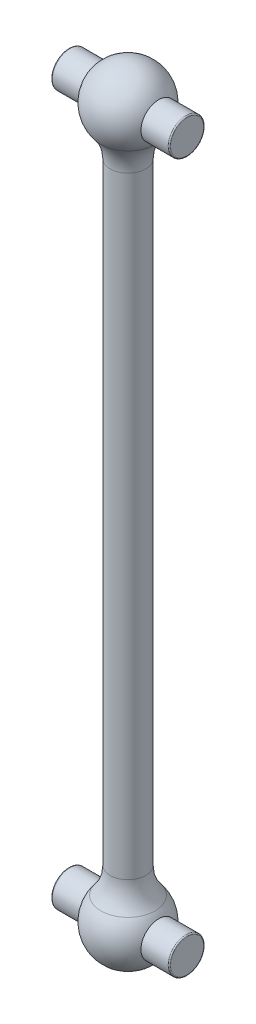
ISO-10303-21;
HEADER;
FILE_DESCRIPTION(('STEP AP214'),'2;1');
FILE_NAME('part.step','',(''),(''),'','','');
FILE_SCHEMA(('AUTOMOTIVE_DESIGN { 1 0 10303 214 1 1 1 1 }'));
ENDSEC;
DATA;
#1=APPLICATION_CONTEXT('core data for automotive mechanical design processes');
#2=APPLICATION_PROTOCOL_DEFINITION('international standard','automotive_design',2000,#1);
#3=PRODUCT_CONTEXT('',#1,'mechanical');
#4=PRODUCT('Part','Part','',(#3));
#5=PRODUCT_RELATED_PRODUCT_CATEGORY('part','',(#4));
#6=PRODUCT_DEFINITION_FORMATION('','',#4);
#7=PRODUCT_DEFINITION_CONTEXT('part definition',#1,'design');
#8=PRODUCT_DEFINITION('design','',#6,#7);
#9=PRODUCT_DEFINITION_SHAPE('','',#8);
#10=(LENGTH_UNIT() NAMED_UNIT(*) SI_UNIT(.MILLI.,.METRE.));
#11=(NAMED_UNIT(*) PLANE_ANGLE_UNIT() SI_UNIT($,.RADIAN.));
#12=(NAMED_UNIT(*) SI_UNIT($,.STERADIAN.) SOLID_ANGLE_UNIT());
#13=UNCERTAINTY_MEASURE_WITH_UNIT(LENGTH_MEASURE(1.E-05),#10,'distance_accuracy_value','');
#14=(GEOMETRIC_REPRESENTATION_CONTEXT(3) GLOBAL_UNCERTAINTY_ASSIGNED_CONTEXT((#13)) GLOBAL_UNIT_ASSIGNED_CONTEXT((#10,
#11,#12)) REPRESENTATION_CONTEXT('',''));
#15=CARTESIAN_POINT('',(0.,0.,0.));
#16=DIRECTION('',(0.,0.,1.));
#17=DIRECTION('',(1.,0.,0.));
#18=AXIS2_PLACEMENT_3D('',#15,#16,#17);
#19=CARTESIAN_POINT('',(0.,38.1,0.));
#20=DIRECTION('',(0.,-1.,0.));
#21=DIRECTION('',(0.,0.,-1.));
#22=AXIS2_PLACEMENT_3D('',#19,#20,#21);
#23=CYLINDRICAL_SURFACE('',#22,1.905);
#24=CARTESIAN_POINT('',(0.,32.8660555159389,0.));
#25=DIRECTION('',(0.,1.,0.));
#26=DIRECTION('',(-1.,0.,0.));
#27=AXIS2_PLACEMENT_3D('',#24,#25,#26);
#28=CIRCLE('',#27,1.905);
#29=CARTESIAN_POINT('',(0.,32.8660555159389,-1.905));
#30=VERTEX_POINT('',#29);
#31=EDGE_CURVE('E81',#30,#30,#28,.T.);
#32=CARTESIAN_POINT('',(0.,-32.8660555159389,0.));
#33=DIRECTION('',(0.,-1.,0.));
#34=DIRECTION('',(1.,0.,0.));
#35=AXIS2_PLACEMENT_3D('',#32,#33,#34);
#36=CIRCLE('',#35,1.905);
#37=CARTESIAN_POINT('',(0.,-32.8660555159389,-1.905));
#38=VERTEX_POINT('',#37);
#39=EDGE_CURVE('E53',#38,#38,#36,.T.);
#40=CARTESIAN_POINT('',(0.,32.8660555159389,-1.905));
#41=CARTESIAN_POINT('',(0.,32.1813460260235,-1.905));
#42=CARTESIAN_POINT('',(0.,31.4966365361081,-1.905));
#43=CARTESIAN_POINT('',(0.,30.1272175562773,-1.905));
#44=CARTESIAN_POINT('',(0.,29.442508066362,-1.905));
#45=CARTESIAN_POINT('',(0.,28.0730890865312,-1.905));
#46=CARTESIAN_POINT('',(0.,27.3883795966158,-1.905));
#47=CARTESIAN_POINT('',(0.,26.018960616785,-1.905));
#48=CARTESIAN_POINT('',(0.,25.3342511268696,-1.905));
#49=CARTESIAN_POINT('',(0.,23.9648321470388,-1.905));
#50=CARTESIAN_POINT('',(0.,23.2801226571234,-1.905));
#51=CARTESIAN_POINT('',(0.,21.9107036772926,-1.905));
#52=CARTESIAN_POINT('',(0.,21.2259941873772,-1.905));
#53=CARTESIAN_POINT('',(0.,19.8565752075464,-1.905));
#54=CARTESIAN_POINT('',(0.,19.171865717631,-1.905));
#55=CARTESIAN_POINT('',(0.,17.8024467378003,-1.905));
#56=CARTESIAN_POINT('',(0.,17.1177372478849,-1.905));
#57=CARTESIAN_POINT('',(0.,15.7483182680541,-1.905));
#58=CARTESIAN_POINT('',(0.,15.0636087781387,-1.905));
#59=CARTESIAN_POINT('',(0.,13.6941897983079,-1.905));
#60=CARTESIAN_POINT('',(0.,13.0094803083925,-1.905));
#61=CARTESIAN_POINT('',(0.,11.6400613285617,-1.905));
#62=CARTESIAN_POINT('',(0.,10.9553518386463,-1.905));
#63=CARTESIAN_POINT('',(0.,9.58593285881552,-1.905));
#64=CARTESIAN_POINT('',(0.,8.90122336890013,-1.905));
#65=CARTESIAN_POINT('',(0.,7.53180438906934,-1.905));
#66=CARTESIAN_POINT('',(0.,6.84709489915395,-1.905));
#67=CARTESIAN_POINT('',(0.,5.47767591932316,-1.905));
#68=CARTESIAN_POINT('',(0.,4.79296642940776,-1.905));
#69=CARTESIAN_POINT('',(0.,3.42354744957698,-1.905));
#70=CARTESIAN_POINT('',(0.,2.73883795966158,-1.905));
#71=CARTESIAN_POINT('',(0.,1.36941897983079,-1.905));
#72=CARTESIAN_POINT('',(0.,0.684709489915396,-1.905));
#73=CARTESIAN_POINT('',(0.,-0.684709489915392,-1.905));
#74=CARTESIAN_POINT('',(0.,-1.36941897983078,-1.905));
#75=CARTESIAN_POINT('',(0.,-2.73883795966157,-1.905));
#76=CARTESIAN_POINT('',(0.,-3.42354744957697,-1.905));
#77=CARTESIAN_POINT('',(0.,-4.79296642940776,-1.905));
#78=CARTESIAN_POINT('',(0.,-5.47767591932316,-1.905));
#79=CARTESIAN_POINT('',(0.,-6.84709489915394,-1.905));
#80=CARTESIAN_POINT('',(0.,-7.53180438906934,-1.905));
#81=CARTESIAN_POINT('',(0.,-8.90122336890012,-1.905));
#82=CARTESIAN_POINT('',(0.,-9.58593285881552,-1.905));
#83=CARTESIAN_POINT('',(0.,-10.9553518386463,-1.905));
#84=CARTESIAN_POINT('',(0.,-11.6400613285617,-1.905));
#85=CARTESIAN_POINT('',(0.,-13.0094803083925,-1.905));
#86=CARTESIAN_POINT('',(0.,-13.6941897983079,-1.905));
#87=CARTESIAN_POINT('',(0.,-15.0636087781387,-1.905));
#88=CARTESIAN_POINT('',(0.,-15.7483182680541,-1.905));
#89=CARTESIAN_POINT('',(0.,-17.1177372478849,-1.905));
#90=CARTESIAN_POINT('',(0.,-17.8024467378002,-1.905));
#91=CARTESIAN_POINT('',(0.,-19.171865717631,-1.905));
#92=CARTESIAN_POINT('',(0.,-19.8565752075464,-1.905));
#93=CARTESIAN_POINT('',(0.,-21.2259941873772,-1.905));
#94=CARTESIAN_POINT('',(0.,-21.9107036772926,-1.905));
#95=CARTESIAN_POINT('',(0.,-23.2801226571234,-1.905));
#96=CARTESIAN_POINT('',(0.,-23.9648321470388,-1.905));
#97=CARTESIAN_POINT('',(0.,-25.3342511268696,-1.905));
#98=CARTESIAN_POINT('',(0.,-26.018960616785,-1.905));
#99=CARTESIAN_POINT('',(0.,-27.3883795966158,-1.905));
#100=CARTESIAN_POINT('',(0.,-28.0730890865312,-1.905));
#101=CARTESIAN_POINT('',(0.,-29.4425080663619,-1.905));
#102=CARTESIAN_POINT('',(0.,-30.1272175562773,-1.905));
#103=CARTESIAN_POINT('',(0.,-31.4966365361081,-1.905));
#104=CARTESIAN_POINT('',(0.,-32.1813460260235,-1.905));
#105=CARTESIAN_POINT('',(0.,-32.8660555159389,-1.905));
#106=B_SPLINE_CURVE_WITH_KNOTS('',3,(#40,#41,#42,#43,#44,#45,#46,#47,#48,#49,#50,#51,#52,#53,
#54,#55,#56,#57,#58,#59,#60,#61,#62,#63,#64,#65,#66,#67,#68,#69,#70,#71,#72,#73,#74,#75,#76,#77,
#78,#79,#80,#81,#82,#83,#84,#85,#86,#87,#88,#89,#90,#91,#92,#93,#94,#95,#96,#97,#98,#99,#100,
#101,#102,#103,#104,#105),.UNSPECIFIED.,.F.,.F.,(4,2,2,2,2,2,2,2,2,2,2,2,2,2,2,2,2,2,2,2,2,2,2,
2,2,2,2,2,2,2,2,2,4),(0.,2.05412846974619,4.10825693949237,6.16238540923855,8.21651387898473,
10.2706423487309,12.3247708184771,14.3788992882233,16.4330277579695,18.4871562277156,
20.5412846974618,22.595413167208,24.6495416369542,26.7036701067004,28.7577985764466,
30.8119270461927,32.8660555159389,34.9201839856851,36.9743124554313,39.0284409251775,
41.0825693949237,43.1366978646698,45.190826334416,47.2449548041622,49.2990832739084,
51.3532117436546,53.4073402134008,55.4614686831469,57.5155971528931,59.5697256226393,
61.6238540923855,63.6779825621317,65.7321110318778),.UNSPECIFIED.);
#107=EDGE_CURVE('BSEAM33',#30,#38,#106,.T.);
#108=ORIENTED_EDGE('',*,*,#31,.F.);
#109=ORIENTED_EDGE('',*,*,#39,.F.);
#110=ORIENTED_EDGE('',*,*,#107,.T.);
#111=ORIENTED_EDGE('',*,*,#107,.F.);
#112=EDGE_LOOP('',(#108,#110,#109,#111));
#113=FACE_BOUND('',#112,.T.);
#114=ADVANCED_FACE('F33',(#113),#23,.T.);
#115=CARTESIAN_POINT('',(0.,38.1,0.));
#116=DIRECTION('',(0.,1.,0.));
#117=DIRECTION('',(1.,0.,0.));
#118=AXIS2_PLACEMENT_3D('',#115,#116,#117);
#119=SPHERICAL_SURFACE('',#118,3.81);
#120=CARTESIAN_POINT('',(0.,35.6509792070943,0.));
#121=DIRECTION('',(0.,1.,0.));
#122=DIRECTION('',(-1.,0.,0.));
#123=AXIS2_PLACEMENT_3D('',#120,#121,#122);
#124=CIRCLE('',#123,2.91862932828332);
#125=CARTESIAN_POINT('',(-2.91862932828331,35.6509792070943,0.));
#126=VERTEX_POINT('',#125);
#127=EDGE_CURVE('E84',#126,#126,#124,.T.);
#128=ORIENTED_EDGE('',*,*,#127,.T.);
#129=EDGE_LOOP('',(#128));
#130=FACE_BOUND('',#129,.T.);
#131=CARTESIAN_POINT('',(3.29955678841871,38.1,0.));
#132=DIRECTION('',(-1.,0.,0.));
#133=DIRECTION('',(0.,0.,1.));
#134=AXIS2_PLACEMENT_3D('',#131,#132,#133);
#135=CIRCLE('',#134,1.905);
#136=CARTESIAN_POINT('',(3.29955678841871,38.1,1.905));
#137=VERTEX_POINT('',#136);
#138=EDGE_CURVE('E78',#137,#137,#135,.F.);
#139=ORIENTED_EDGE('',*,*,#138,.F.);
#140=EDGE_LOOP('',(#139));
#141=FACE_BOUND('',#140,.T.);
#142=CARTESIAN_POINT('',(-3.29955678841871,38.1,0.));
#143=DIRECTION('',(1.,0.,0.));
#144=DIRECTION('',(0.,0.,-1.));
#145=AXIS2_PLACEMENT_3D('',#142,#143,#144);
#146=CIRCLE('',#145,1.905);
#147=CARTESIAN_POINT('',(-3.29955678841871,38.1,-1.905));
#148=VERTEX_POINT('',#147);
#149=EDGE_CURVE('E75',#148,#148,#146,.F.);
#150=ORIENTED_EDGE('',*,*,#149,.F.);
#151=EDGE_LOOP('',(#150));
#152=FACE_BOUND('',#151,.T.);
#153=ADVANCED_FACE('F110',(#130,#141,#152),#119,.T.);
#154=CARTESIAN_POINT('',(0.,32.8660555159389,0.));
#155=DIRECTION('',(0.,1.,0.));
#156=DIRECTION('',(-1.,0.,0.));
#157=AXIS2_PLACEMENT_3D('',#154,#155,#156);
#158=TOROIDAL_SURFACE('',#157,6.23757214231844,4.33257214231844);
#159=ORIENTED_EDGE('',*,*,#127,.F.);
#160=EDGE_LOOP('',(#159));
#161=FACE_BOUND('',#160,.T.);
#162=ORIENTED_EDGE('',*,*,#31,.T.);
#163=EDGE_LOOP('',(#162));
#164=FACE_BOUND('',#163,.T.);
#165=ADVANCED_FACE('F116',(#161,#164),#158,.F.);
#166=CARTESIAN_POINT('',(6.35,38.1,0.));
#167=DIRECTION('',(1.,0.,0.));
#168=DIRECTION('',(0.,0.,-1.));
#169=AXIS2_PLACEMENT_3D('',#166,#167,#168);
#170=PLANE('',#169);
#171=CARTESIAN_POINT('',(6.35,38.1,0.));
#172=DIRECTION('',(1.,0.,0.));
#173=DIRECTION('',(0.,0.,-1.));
#174=AXIS2_PLACEMENT_3D('',#171,#172,#173);
#175=CIRCLE('',#174,1.778);
#176=CARTESIAN_POINT('',(6.35,38.1,-1.778));
#177=VERTEX_POINT('',#176);
#178=EDGE_CURVE('E66',#177,#177,#175,.T.);
#179=ORIENTED_EDGE('',*,*,#178,.T.);
#180=EDGE_LOOP('',(#179));
#181=FACE_BOUND('',#180,.T.);
#182=ADVANCED_FACE('F240',(#181),#170,.T.);
#183=CARTESIAN_POINT('',(6.35,38.1,0.));
#184=DIRECTION('',(-1.,0.,0.));
#185=DIRECTION('',(0.,0.,1.));
#186=AXIS2_PLACEMENT_3D('',#183,#184,#185);
#187=CYLINDRICAL_SURFACE('',#186,1.905);
#188=CARTESIAN_POINT('',(6.223,38.1,0.));
#189=DIRECTION('',(1.,0.,0.));
#190=DIRECTION('',(0.,0.,-1.));
#191=AXIS2_PLACEMENT_3D('',#188,#189,#190);
#192=CIRCLE('',#191,1.905);
#193=CARTESIAN_POINT('',(6.223,38.1,-1.905));
#194=VERTEX_POINT('',#193);
#195=EDGE_CURVE('E63',#194,#194,#192,.F.);
#196=ORIENTED_EDGE('',*,*,#195,.T.);
#197=EDGE_LOOP('',(#196));
#198=FACE_BOUND('',#197,.T.);
#199=ORIENTED_EDGE('',*,*,#138,.T.);
#200=EDGE_LOOP('',(#199));
#201=FACE_BOUND('',#200,.T.);
#202=ADVANCED_FACE('F230',(#198,#201),#187,.T.);
#203=CARTESIAN_POINT('',(-6.223,38.1,0.));
#204=DIRECTION('',(1.,0.,0.));
#205=DIRECTION('',(0.,0.,-1.));
#206=AXIS2_PLACEMENT_3D('',#203,#204,#205);
#207=CIRCLE('',#206,1.905);
#208=CARTESIAN_POINT('',(-6.223,38.1,-1.905));
#209=VERTEX_POINT('',#208);
#210=EDGE_CURVE('E72',#209,#209,#207,.T.);
#211=ORIENTED_EDGE('',*,*,#210,.T.);
#212=EDGE_LOOP('',(#211));
#213=FACE_BOUND('',#212,.T.);
#214=ORIENTED_EDGE('',*,*,#149,.T.);
#215=EDGE_LOOP('',(#214));
#216=FACE_BOUND('',#215,.T.);
#217=ADVANCED_FACE('F220',(#213,#216),#187,.T.);
#218=CARTESIAN_POINT('',(-6.35,38.1,0.));
#219=DIRECTION('',(1.,0.,0.));
#220=DIRECTION('',(0.,0.,-1.));
#221=AXIS2_PLACEMENT_3D('',#218,#219,#220);
#222=PLANE('',#221);
#223=CARTESIAN_POINT('',(-6.35,38.1,0.));
#224=DIRECTION('',(1.,0.,0.));
#225=DIRECTION('',(0.,0.,-1.));
#226=AXIS2_PLACEMENT_3D('',#223,#224,#225);
#227=CIRCLE('',#226,1.778);
#228=CARTESIAN_POINT('',(-6.35,38.1,-1.778));
#229=VERTEX_POINT('',#228);
#230=EDGE_CURVE('E69',#229,#229,#227,.F.);
#231=ORIENTED_EDGE('',*,*,#230,.T.);
#232=EDGE_LOOP('',(#231));
#233=FACE_BOUND('',#232,.T.);
#234=ADVANCED_FACE('F124',(#233),#222,.F.);
#235=CARTESIAN_POINT('',(-6.223,38.1,0.));
#236=DIRECTION('',(1.,0.,0.));
#237=DIRECTION('',(0.,0.,-1.));
#238=AXIS2_PLACEMENT_3D('',#235,#236,#237);
#239=TOROIDAL_SURFACE('',#238,1.778,0.127);
#240=ORIENTED_EDGE('',*,*,#230,.F.);
#241=EDGE_LOOP('',(#240));
#242=FACE_BOUND('',#241,.T.);
#243=ORIENTED_EDGE('',*,*,#210,.F.);
#244=EDGE_LOOP('',(#243));
#245=FACE_BOUND('',#244,.T.);
#246=ADVANCED_FACE('F104',(#242,#245),#239,.T.);
#247=CARTESIAN_POINT('',(6.223,38.1,0.));
#248=DIRECTION('',(1.,0.,0.));
#249=DIRECTION('',(0.,0.,-1.));
#250=AXIS2_PLACEMENT_3D('',#247,#248,#249);
#251=TOROIDAL_SURFACE('',#250,1.778,0.127);
#252=ORIENTED_EDGE('',*,*,#195,.F.);
#253=EDGE_LOOP('',(#252));
#254=FACE_BOUND('',#253,.T.);
#255=ORIENTED_EDGE('',*,*,#178,.F.);
#256=EDGE_LOOP('',(#255));
#257=FACE_BOUND('',#256,.T.);
#258=ADVANCED_FACE('F95',(#254,#257),#251,.T.);
#259=CARTESIAN_POINT('',(0.,-38.1,0.));
#260=DIRECTION('',(0.,-1.,0.));
#261=DIRECTION('',(1.,0.,0.));
#262=AXIS2_PLACEMENT_3D('',#259,#260,#261);
#263=SPHERICAL_SURFACE('',#262,3.81);
#264=CARTESIAN_POINT('',(-3.29955678841871,-38.1,0.));
#265=DIRECTION('',(1.,0.,0.));
#266=DIRECTION('',(0.,0.,-1.));
#267=AXIS2_PLACEMENT_3D('',#264,#265,#266);
#268=CIRCLE('',#267,1.905);
#269=CARTESIAN_POINT('',(-3.29955678841871,-38.1,-1.905));
#270=VERTEX_POINT('',#269);
#271=EDGE_CURVE('E54',#270,#270,#268,.T.);
#272=ORIENTED_EDGE('',*,*,#271,.T.);
#273=EDGE_LOOP('',(#272));
#274=FACE_BOUND('',#273,.T.);
#275=CARTESIAN_POINT('',(3.29955678841871,-38.1,0.));
#276=DIRECTION('',(-1.,0.,0.));
#277=DIRECTION('',(0.,0.,1.));
#278=AXIS2_PLACEMENT_3D('',#275,#276,#277);
#279=CIRCLE('',#278,1.905);
#280=CARTESIAN_POINT('',(3.29955678841871,-38.1,1.905));
#281=VERTEX_POINT('',#280);
#282=EDGE_CURVE('E58',#281,#281,#279,.T.);
#283=ORIENTED_EDGE('',*,*,#282,.T.);
#284=EDGE_LOOP('',(#283));
#285=FACE_BOUND('',#284,.T.);
#286=CARTESIAN_POINT('',(0.,-35.6509792070943,0.));
#287=DIRECTION('',(0.,1.,0.));
#288=DIRECTION('',(-1.,0.,0.));
#289=AXIS2_PLACEMENT_3D('',#286,#287,#288);
#290=CIRCLE('',#289,2.91862932828332);
#291=CARTESIAN_POINT('',(-2.91862932828331,-35.6509792070943,0.));
#292=VERTEX_POINT('',#291);
#293=EDGE_CURVE('E57',#292,#292,#290,.T.);
#294=ORIENTED_EDGE('',*,*,#293,.F.);
#295=EDGE_LOOP('',(#294));
#296=FACE_BOUND('',#295,.T.);
#297=ADVANCED_FACE('F93',(#274,#285,#296),#263,.T.);
#298=CARTESIAN_POINT('',(0.,-32.8660555159389,0.));
#299=DIRECTION('',(0.,-1.,0.));
#300=DIRECTION('',(-1.,0.,0.));
#301=AXIS2_PLACEMENT_3D('',#298,#299,#300);
#302=TOROIDAL_SURFACE('',#301,6.23757214231844,4.33257214231844);
#303=ORIENTED_EDGE('',*,*,#293,.T.);
#304=EDGE_LOOP('',(#303));
#305=FACE_BOUND('',#304,.T.);
#306=ORIENTED_EDGE('',*,*,#39,.T.);
#307=EDGE_LOOP('',(#306));
#308=FACE_BOUND('',#307,.T.);
#309=ADVANCED_FACE('F90',(#305,#308),#302,.F.);
#310=CARTESIAN_POINT('',(6.35,-38.1,0.));
#311=DIRECTION('',(1.,0.,0.));
#312=DIRECTION('',(0.,0.,-1.));
#313=AXIS2_PLACEMENT_3D('',#310,#311,#312);
#314=PLANE('',#313);
#315=CARTESIAN_POINT('',(6.35,-38.1,0.));
#316=DIRECTION('',(1.,0.,0.));
#317=DIRECTION('',(0.,0.,-1.));
#318=AXIS2_PLACEMENT_3D('',#315,#316,#317);
#319=CIRCLE('',#318,1.778);
#320=CARTESIAN_POINT('',(6.35,-38.1,-1.778));
#321=VERTEX_POINT('',#320);
#322=EDGE_CURVE('E10',#321,#321,#319,.T.);
#323=ORIENTED_EDGE('',*,*,#322,.T.);
#324=EDGE_LOOP('',(#323));
#325=FACE_BOUND('',#324,.T.);
#326=ADVANCED_FACE('F102',(#325),#314,.T.);
#327=CARTESIAN_POINT('',(6.35,-38.1,0.));
#328=DIRECTION('',(-1.,0.,0.));
#329=DIRECTION('',(0.,0.,1.));
#330=AXIS2_PLACEMENT_3D('',#327,#328,#329);
#331=CYLINDRICAL_SURFACE('',#330,1.905);
#332=CARTESIAN_POINT('',(6.223,-38.1,0.));
#333=DIRECTION('',(1.,0.,0.));
#334=DIRECTION('',(0.,0.,-1.));
#335=AXIS2_PLACEMENT_3D('',#332,#333,#334);
#336=CIRCLE('',#335,1.905);
#337=CARTESIAN_POINT('',(6.223,-38.1,-1.905));
#338=VERTEX_POINT('',#337);
#339=EDGE_CURVE('E40',#338,#338,#336,.F.);
#340=ORIENTED_EDGE('',*,*,#339,.T.);
#341=EDGE_LOOP('',(#340));
#342=FACE_BOUND('',#341,.T.);
#343=ORIENTED_EDGE('',*,*,#282,.F.);
#344=EDGE_LOOP('',(#343));
#345=FACE_BOUND('',#344,.T.);
#346=ADVANCED_FACE('F144',(#342,#345),#331,.T.);
#347=CARTESIAN_POINT('',(-6.223,-38.1,0.));
#348=DIRECTION('',(1.,0.,0.));
#349=DIRECTION('',(0.,0.,-1.));
#350=AXIS2_PLACEMENT_3D('',#347,#348,#349);
#351=CIRCLE('',#350,1.905);
#352=CARTESIAN_POINT('',(-6.223,-38.1,-1.905));
#353=VERTEX_POINT('',#352);
#354=EDGE_CURVE('E44',#353,#353,#351,.T.);
#355=ORIENTED_EDGE('',*,*,#354,.T.);
#356=EDGE_LOOP('',(#355));
#357=FACE_BOUND('',#356,.T.);
#358=ORIENTED_EDGE('',*,*,#271,.F.);
#359=EDGE_LOOP('',(#358));
#360=FACE_BOUND('',#359,.T.);
#361=ADVANCED_FACE('F135',(#357,#360),#331,.T.);
#362=CARTESIAN_POINT('',(-6.35,-38.1,0.));
#363=DIRECTION('',(1.,0.,0.));
#364=DIRECTION('',(0.,0.,-1.));
#365=AXIS2_PLACEMENT_3D('',#362,#363,#364);
#366=PLANE('',#365);
#367=CARTESIAN_POINT('',(-6.35,-38.1,0.));
#368=DIRECTION('',(1.,0.,0.));
#369=DIRECTION('',(0.,0.,-1.));
#370=AXIS2_PLACEMENT_3D('',#367,#368,#369);
#371=CIRCLE('',#370,1.778);
#372=CARTESIAN_POINT('',(-6.35,-38.1,-1.778));
#373=VERTEX_POINT('',#372);
#374=EDGE_CURVE('E48',#373,#373,#371,.F.);
#375=ORIENTED_EDGE('',*,*,#374,.T.);
#376=EDGE_LOOP('',(#375));
#377=FACE_BOUND('',#376,.T.);
#378=ADVANCED_FACE('F128',(#377),#366,.F.);
#379=CARTESIAN_POINT('',(-6.223,-38.1,0.));
#380=DIRECTION('',(1.,0.,0.));
#381=DIRECTION('',(0.,0.,-1.));
#382=AXIS2_PLACEMENT_3D('',#379,#380,#381);
#383=TOROIDAL_SURFACE('',#382,1.778,0.127);
#384=ORIENTED_EDGE('',*,*,#354,.F.);
#385=EDGE_LOOP('',(#384));
#386=FACE_BOUND('',#385,.T.);
#387=ORIENTED_EDGE('',*,*,#374,.F.);
#388=EDGE_LOOP('',(#387));
#389=FACE_BOUND('',#388,.T.);
#390=ADVANCED_FACE('F126',(#386,#389),#383,.T.);
#391=CARTESIAN_POINT('',(6.223,-38.1,0.));
#392=DIRECTION('',(1.,0.,0.));
#393=DIRECTION('',(0.,0.,-1.));
#394=AXIS2_PLACEMENT_3D('',#391,#392,#393);
#395=TOROIDAL_SURFACE('',#394,1.778,0.127);
#396=ORIENTED_EDGE('',*,*,#322,.F.);
#397=EDGE_LOOP('',(#396));
#398=FACE_BOUND('',#397,.T.);
#399=ORIENTED_EDGE('',*,*,#339,.F.);
#400=EDGE_LOOP('',(#399));
#401=FACE_BOUND('',#400,.T.);
#402=ADVANCED_FACE('F35',(#398,#401),#395,.T.);
#403=CLOSED_SHELL('',(#114,#153,#165,#182,#202,#217,#234,#246,#258,#297,#309,#326,#346,#361,
#378,#390,#402));
#404=MANIFOLD_SOLID_BREP('B2',#403);
#405=ADVANCED_BREP_SHAPE_REPRESENTATION('',(#18,#404),#14);
#406=SHAPE_DEFINITION_REPRESENTATION(#9,#405);
ENDSEC;
END-ISO-10303-21;
